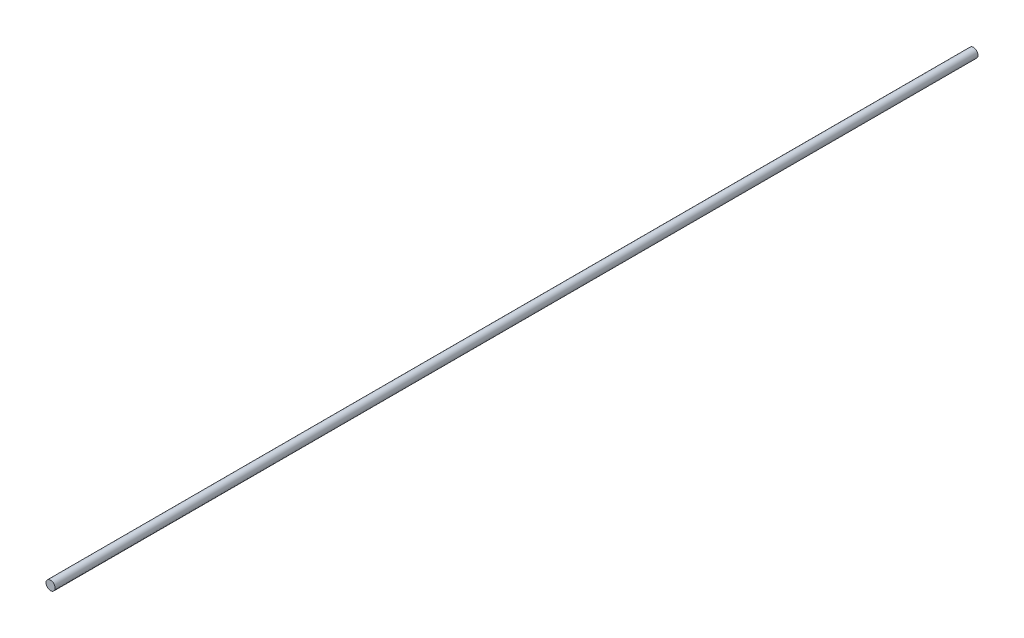
ISO-10303-21;
HEADER;
FILE_DESCRIPTION(('STEP AP214'),'2;1');
FILE_NAME('part.step','',(''),(''),'','','');
FILE_SCHEMA(('AUTOMOTIVE_DESIGN { 1 0 10303 214 1 1 1 1 }'));
ENDSEC;
DATA;
#1=APPLICATION_CONTEXT('core data for automotive mechanical design processes');
#2=APPLICATION_PROTOCOL_DEFINITION('international standard','automotive_design',2000,#1);
#3=PRODUCT_CONTEXT('',#1,'mechanical');
#4=PRODUCT('Part','Part','',(#3));
#5=PRODUCT_RELATED_PRODUCT_CATEGORY('part','',(#4));
#6=PRODUCT_DEFINITION_FORMATION('','',#4);
#7=PRODUCT_DEFINITION_CONTEXT('part definition',#1,'design');
#8=PRODUCT_DEFINITION('design','',#6,#7);
#9=PRODUCT_DEFINITION_SHAPE('','',#8);
#10=(LENGTH_UNIT() NAMED_UNIT(*) SI_UNIT(.MILLI.,.METRE.));
#11=(NAMED_UNIT(*) PLANE_ANGLE_UNIT() SI_UNIT($,.RADIAN.));
#12=(NAMED_UNIT(*) SI_UNIT($,.STERADIAN.) SOLID_ANGLE_UNIT());
#13=UNCERTAINTY_MEASURE_WITH_UNIT(LENGTH_MEASURE(1.E-05),#10,'distance_accuracy_value','');
#14=(GEOMETRIC_REPRESENTATION_CONTEXT(3) GLOBAL_UNCERTAINTY_ASSIGNED_CONTEXT((#13)) GLOBAL_UNIT_ASSIGNED_CONTEXT((#10,
#11,#12)) REPRESENTATION_CONTEXT('',''));
#15=CARTESIAN_POINT('',(0.,0.,0.));
#16=DIRECTION('',(0.,0.,1.));
#17=DIRECTION('',(1.,0.,0.));
#18=AXIS2_PLACEMENT_3D('',#15,#16,#17);
#19=CARTESIAN_POINT('',(0.,0.,810.));
#20=DIRECTION('',(0.,0.,-1.));
#21=DIRECTION('',(-1.,0.,0.));
#22=AXIS2_PLACEMENT_3D('',#19,#20,#21);
#23=CYLINDRICAL_SURFACE('',#22,4.);
#24=CARTESIAN_POINT('',(0.,0.,810.));
#25=DIRECTION('',(0.,0.,1.));
#26=DIRECTION('',(1.,0.,0.));
#27=AXIS2_PLACEMENT_3D('',#24,#25,#26);
#28=CIRCLE('',#27,4.);
#29=CARTESIAN_POINT('',(4.,0.,810.));
#30=VERTEX_POINT('',#29);
#31=EDGE_CURVE('E10',#30,#30,#28,.T.);
#32=ORIENTED_EDGE('',*,*,#31,.F.);
#33=EDGE_LOOP('',(#32));
#34=FACE_BOUND('',#33,.T.);
#35=CARTESIAN_POINT('',(0.,0.,0.));
#36=DIRECTION('',(0.,0.,1.));
#37=DIRECTION('',(1.,0.,0.));
#38=AXIS2_PLACEMENT_3D('',#35,#36,#37);
#39=CIRCLE('',#38,4.);
#40=CARTESIAN_POINT('',(4.,0.,0.));
#41=VERTEX_POINT('',#40);
#42=EDGE_CURVE('E42',#41,#41,#39,.T.);
#43=ORIENTED_EDGE('',*,*,#42,.T.);
#44=EDGE_LOOP('',(#43));
#45=FACE_BOUND('',#44,.T.);
#46=ADVANCED_FACE('F39',(#34,#45),#23,.T.);
#47=CARTESIAN_POINT('',(0.,0.,810.));
#48=DIRECTION('',(0.,0.,1.));
#49=DIRECTION('',(1.,0.,0.));
#50=AXIS2_PLACEMENT_3D('',#47,#48,#49);
#51=PLANE('',#50);
#52=ORIENTED_EDGE('',*,*,#31,.T.);
#53=EDGE_LOOP('',(#52));
#54=FACE_BOUND('',#53,.T.);
#55=ADVANCED_FACE('F54',(#54),#51,.T.);
#56=CARTESIAN_POINT('',(0.,0.,0.));
#57=DIRECTION('',(0.,0.,1.));
#58=DIRECTION('',(1.,0.,0.));
#59=AXIS2_PLACEMENT_3D('',#56,#57,#58);
#60=PLANE('',#59);
#61=ORIENTED_EDGE('',*,*,#42,.F.);
#62=EDGE_LOOP('',(#61));
#63=FACE_BOUND('',#62,.T.);
#64=ADVANCED_FACE('F52',(#63),#60,.F.);
#65=CLOSED_SHELL('',(#46,#55,#64));
#66=MANIFOLD_SOLID_BREP('B2',#65);
#67=ADVANCED_BREP_SHAPE_REPRESENTATION('',(#18,#66),#14);
#68=SHAPE_DEFINITION_REPRESENTATION(#9,#67);
ENDSEC;
END-ISO-10303-21;
